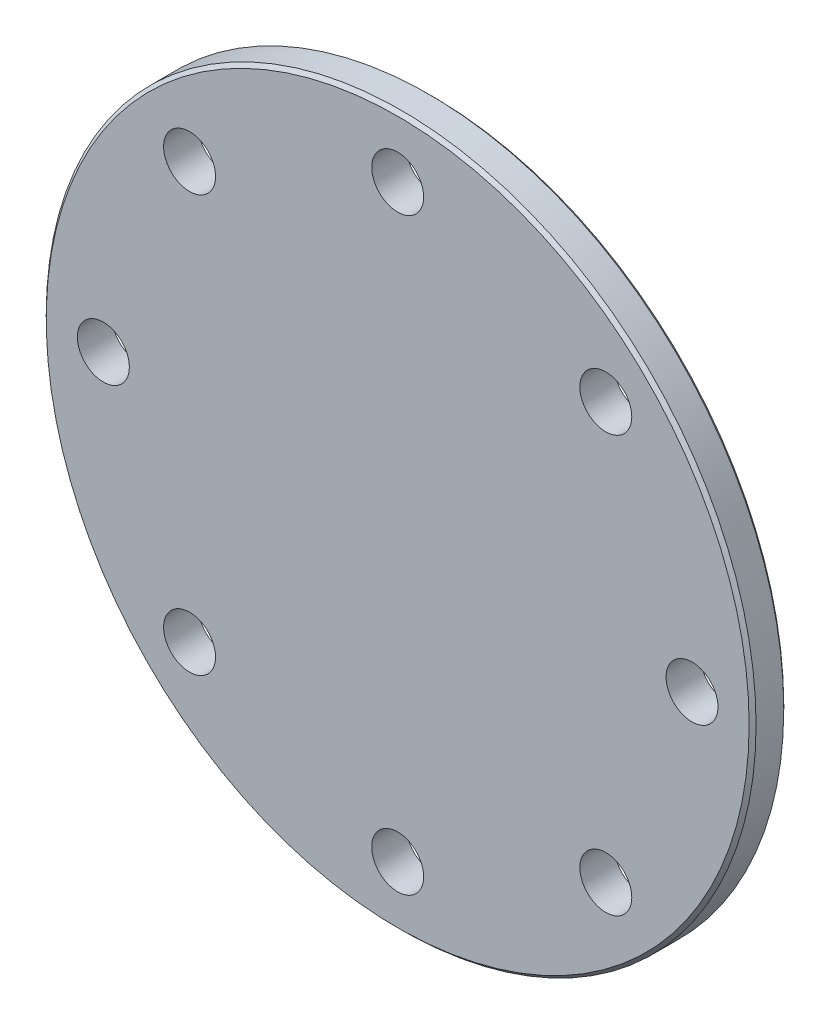
ISO-10303-21;
HEADER;
FILE_DESCRIPTION(('STEP AP214'),'2;1');
FILE_NAME('part.step','',(''),(''),'','','');
FILE_SCHEMA(('AUTOMOTIVE_DESIGN { 1 0 10303 214 1 1 1 1 }'));
ENDSEC;
DATA;
#1=APPLICATION_CONTEXT('core data for automotive mechanical design processes');
#2=APPLICATION_PROTOCOL_DEFINITION('international standard','automotive_design',2000,#1);
#3=PRODUCT_CONTEXT('',#1,'mechanical');
#4=PRODUCT('Part','Part','',(#3));
#5=PRODUCT_RELATED_PRODUCT_CATEGORY('part','',(#4));
#6=PRODUCT_DEFINITION_FORMATION('','',#4);
#7=PRODUCT_DEFINITION_CONTEXT('part definition',#1,'design');
#8=PRODUCT_DEFINITION('design','',#6,#7);
#9=PRODUCT_DEFINITION_SHAPE('','',#8);
#10=(LENGTH_UNIT() NAMED_UNIT(*) SI_UNIT(.MILLI.,.METRE.));
#11=(NAMED_UNIT(*) PLANE_ANGLE_UNIT() SI_UNIT($,.RADIAN.));
#12=(NAMED_UNIT(*) SI_UNIT($,.STERADIAN.) SOLID_ANGLE_UNIT());
#13=UNCERTAINTY_MEASURE_WITH_UNIT(LENGTH_MEASURE(1.E-05),#10,'distance_accuracy_value','');
#14=(GEOMETRIC_REPRESENTATION_CONTEXT(3) GLOBAL_UNCERTAINTY_ASSIGNED_CONTEXT((#13)) GLOBAL_UNIT_ASSIGNED_CONTEXT((#10,
#11,#12)) REPRESENTATION_CONTEXT('',''));
#15=CARTESIAN_POINT('',(0.,0.,0.));
#16=DIRECTION('',(0.,0.,1.));
#17=DIRECTION('',(1.,0.,0.));
#18=AXIS2_PLACEMENT_3D('',#15,#16,#17);
#19=CARTESIAN_POINT('',(0.,0.,20.));
#20=DIRECTION('',(0.,0.,1.));
#21=DIRECTION('',(1.,0.,0.));
#22=AXIS2_PLACEMENT_3D('',#19,#20,#21);
#23=PLANE('',#22);
#24=CARTESIAN_POINT('',(0.,0.,20.));
#25=DIRECTION('',(0.,0.,1.));
#26=DIRECTION('',(1.,0.,0.));
#27=AXIS2_PLACEMENT_3D('',#24,#25,#26);
#28=CIRCLE('',#27,203.);
#29=CARTESIAN_POINT('',(203.,0.,20.));
#30=VERTEX_POINT('',#29);
#31=EDGE_CURVE('E10',#30,#30,#28,.T.);
#32=ORIENTED_EDGE('',*,*,#31,.T.);
#33=EDGE_LOOP('',(#32));
#34=FACE_BOUND('',#33,.T.);
#35=CARTESIAN_POINT('',(-169.999999999992,-7.67202457601036E-12,20.));
#36=DIRECTION('',(0.,0.,1.));
#37=DIRECTION('',(1.,0.,0.));
#38=AXIS2_PLACEMENT_3D('',#35,#36,#37);
#39=CIRCLE('',#38,15.);
#40=CARTESIAN_POINT('',(-154.999999999992,-7.67202457601036E-12,20.));
#41=VERTEX_POINT('',#40);
#42=EDGE_CURVE('E85',#41,#41,#39,.T.);
#43=ORIENTED_EDGE('',*,*,#42,.F.);
#44=EDGE_LOOP('',(#43));
#45=FACE_BOUND('',#44,.T.);
#46=CARTESIAN_POINT('',(1.53024111608497E-11,-170.,20.));
#47=DIRECTION('',(0.,0.,1.));
#48=DIRECTION('',(1.,0.,0.));
#49=AXIS2_PLACEMENT_3D('',#46,#47,#48);
#50=CIRCLE('',#49,15.);
#51=CARTESIAN_POINT('',(15.0000000000153,-170.,20.));
#52=VERTEX_POINT('',#51);
#53=EDGE_CURVE('E73',#52,#52,#50,.T.);
#54=ORIENTED_EDGE('',*,*,#53,.F.);
#55=EDGE_LOOP('',(#54));
#56=FACE_BOUND('',#55,.T.);
#57=CARTESIAN_POINT('',(170.000000000008,7.65120558042486E-12,20.));
#58=DIRECTION('',(0.,0.,1.));
#59=DIRECTION('',(1.,0.,0.));
#60=AXIS2_PLACEMENT_3D('',#57,#58,#59);
#61=CIRCLE('',#60,15.);
#62=CARTESIAN_POINT('',(185.000000000008,7.65120558042486E-12,20.));
#63=VERTEX_POINT('',#62);
#64=EDGE_CURVE('E61',#63,#63,#61,.T.);
#65=ORIENTED_EDGE('',*,*,#64,.F.);
#66=EDGE_LOOP('',(#65));
#67=FACE_BOUND('',#66,.T.);
#68=CARTESIAN_POINT('',(0.,170.,20.));
#69=DIRECTION('',(0.,0.,1.));
#70=DIRECTION('',(1.,0.,0.));
#71=AXIS2_PLACEMENT_3D('',#68,#69,#70);
#72=CIRCLE('',#71,15.);
#73=CARTESIAN_POINT('',(15.,170.,20.));
#74=VERTEX_POINT('',#73);
#75=EDGE_CURVE('E51',#74,#74,#72,.T.);
#76=ORIENTED_EDGE('',*,*,#75,.F.);
#77=EDGE_LOOP('',(#76));
#78=FACE_BOUND('',#77,.T.);
#79=CARTESIAN_POINT('',(120.208152801715,120.208152801718,20.));
#80=DIRECTION('',(0.,0.,1.));
#81=DIRECTION('',(1.,0.,0.));
#82=AXIS2_PLACEMENT_3D('',#79,#80,#81);
#83=CIRCLE('',#82,15.0000000000009);
#84=CARTESIAN_POINT('',(135.208152801716,120.208152801718,20.));
#85=VERTEX_POINT('',#84);
#86=EDGE_CURVE('E55',#85,#85,#83,.T.);
#87=ORIENTED_EDGE('',*,*,#86,.F.);
#88=EDGE_LOOP('',(#87));
#89=FACE_BOUND('',#88,.T.);
#90=CARTESIAN_POINT('',(120.208152801726,-120.208152801708,20.));
#91=DIRECTION('',(0.,0.,1.));
#92=DIRECTION('',(1.,0.,0.));
#93=AXIS2_PLACEMENT_3D('',#90,#91,#92);
#94=CIRCLE('',#93,15.);
#95=CARTESIAN_POINT('',(135.208152801726,-120.208152801708,20.));
#96=VERTEX_POINT('',#95);
#97=EDGE_CURVE('E67',#96,#96,#94,.T.);
#98=ORIENTED_EDGE('',*,*,#97,.F.);
#99=EDGE_LOOP('',(#98));
#100=FACE_BOUND('',#99,.T.);
#101=CARTESIAN_POINT('',(-120.2081528017,-120.208152801719,20.));
#102=DIRECTION('',(0.,0.,1.));
#103=DIRECTION('',(1.,0.,0.));
#104=AXIS2_PLACEMENT_3D('',#101,#102,#103);
#105=CIRCLE('',#104,15.);
#106=CARTESIAN_POINT('',(-105.2081528017,-120.208152801719,20.));
#107=VERTEX_POINT('',#106);
#108=EDGE_CURVE('E79',#107,#107,#105,.T.);
#109=ORIENTED_EDGE('',*,*,#108,.F.);
#110=EDGE_LOOP('',(#109));
#111=FACE_BOUND('',#110,.T.);
#112=CARTESIAN_POINT('',(-120.208152801711,120.208152801708,20.));
#113=DIRECTION('',(0.,0.,1.));
#114=DIRECTION('',(1.,0.,0.));
#115=AXIS2_PLACEMENT_3D('',#112,#113,#114);
#116=CIRCLE('',#115,15.);
#117=CARTESIAN_POINT('',(-105.208152801711,120.208152801708,20.));
#118=VERTEX_POINT('',#117);
#119=EDGE_CURVE('E91',#118,#118,#116,.T.);
#120=ORIENTED_EDGE('',*,*,#119,.F.);
#121=EDGE_LOOP('',(#120));
#122=FACE_BOUND('',#121,.T.);
#123=ADVANCED_FACE('F31',(#34,#45,#56,#67,#78,#89,#100,#111,#122),#23,.T.);
#124=CARTESIAN_POINT('',(0.,0.,0.));
#125=DIRECTION('',(0.,0.,1.));
#126=DIRECTION('',(1.,0.,0.));
#127=AXIS2_PLACEMENT_3D('',#124,#125,#126);
#128=PLANE('',#127);
#129=CARTESIAN_POINT('',(0.,0.,0.));
#130=DIRECTION('',(0.,0.,1.));
#131=DIRECTION('',(1.,0.,0.));
#132=AXIS2_PLACEMENT_3D('',#129,#130,#131);
#133=CIRCLE('',#132,203.);
#134=CARTESIAN_POINT('',(203.,0.,0.));
#135=VERTEX_POINT('',#134);
#136=EDGE_CURVE('E38',#135,#135,#133,.F.);
#137=ORIENTED_EDGE('',*,*,#136,.T.);
#138=EDGE_LOOP('',(#137));
#139=FACE_BOUND('',#138,.T.);
#140=CARTESIAN_POINT('',(0.,170.,0.));
#141=DIRECTION('',(0.,0.,1.));
#142=DIRECTION('',(1.,0.,0.));
#143=AXIS2_PLACEMENT_3D('',#140,#141,#142);
#144=CIRCLE('',#143,15.);
#145=CARTESIAN_POINT('',(15.,170.,0.));
#146=VERTEX_POINT('',#145);
#147=EDGE_CURVE('E52',#146,#146,#144,.T.);
#148=ORIENTED_EDGE('',*,*,#147,.T.);
#149=EDGE_LOOP('',(#148));
#150=FACE_BOUND('',#149,.T.);
#151=CARTESIAN_POINT('',(120.208152801715,120.208152801718,0.));
#152=DIRECTION('',(0.,0.,1.));
#153=DIRECTION('',(1.,0.,0.));
#154=AXIS2_PLACEMENT_3D('',#151,#152,#153);
#155=CIRCLE('',#154,15.0000000000009);
#156=CARTESIAN_POINT('',(135.208152801716,120.208152801718,0.));
#157=VERTEX_POINT('',#156);
#158=EDGE_CURVE('E58',#157,#157,#155,.T.);
#159=ORIENTED_EDGE('',*,*,#158,.T.);
#160=EDGE_LOOP('',(#159));
#161=FACE_BOUND('',#160,.T.);
#162=CARTESIAN_POINT('',(170.000000000008,7.65120558042486E-12,0.));
#163=DIRECTION('',(0.,0.,1.));
#164=DIRECTION('',(1.,0.,0.));
#165=AXIS2_PLACEMENT_3D('',#162,#163,#164);
#166=CIRCLE('',#165,15.);
#167=CARTESIAN_POINT('',(185.000000000008,7.65120558042486E-12,0.));
#168=VERTEX_POINT('',#167);
#169=EDGE_CURVE('E64',#168,#168,#166,.T.);
#170=ORIENTED_EDGE('',*,*,#169,.T.);
#171=EDGE_LOOP('',(#170));
#172=FACE_BOUND('',#171,.T.);
#173=CARTESIAN_POINT('',(120.208152801726,-120.208152801708,0.));
#174=DIRECTION('',(0.,0.,1.));
#175=DIRECTION('',(1.,0.,0.));
#176=AXIS2_PLACEMENT_3D('',#173,#174,#175);
#177=CIRCLE('',#176,15.);
#178=CARTESIAN_POINT('',(135.208152801726,-120.208152801708,0.));
#179=VERTEX_POINT('',#178);
#180=EDGE_CURVE('E70',#179,#179,#177,.T.);
#181=ORIENTED_EDGE('',*,*,#180,.T.);
#182=EDGE_LOOP('',(#181));
#183=FACE_BOUND('',#182,.T.);
#184=CARTESIAN_POINT('',(1.53024111608497E-11,-170.,0.));
#185=DIRECTION('',(0.,0.,1.));
#186=DIRECTION('',(1.,0.,0.));
#187=AXIS2_PLACEMENT_3D('',#184,#185,#186);
#188=CIRCLE('',#187,15.);
#189=CARTESIAN_POINT('',(15.0000000000153,-170.,0.));
#190=VERTEX_POINT('',#189);
#191=EDGE_CURVE('E76',#190,#190,#188,.T.);
#192=ORIENTED_EDGE('',*,*,#191,.T.);
#193=EDGE_LOOP('',(#192));
#194=FACE_BOUND('',#193,.T.);
#195=CARTESIAN_POINT('',(-120.2081528017,-120.208152801719,0.));
#196=DIRECTION('',(0.,0.,1.));
#197=DIRECTION('',(1.,0.,0.));
#198=AXIS2_PLACEMENT_3D('',#195,#196,#197);
#199=CIRCLE('',#198,15.);
#200=CARTESIAN_POINT('',(-105.2081528017,-120.208152801719,0.));
#201=VERTEX_POINT('',#200);
#202=EDGE_CURVE('E82',#201,#201,#199,.T.);
#203=ORIENTED_EDGE('',*,*,#202,.T.);
#204=EDGE_LOOP('',(#203));
#205=FACE_BOUND('',#204,.T.);
#206=CARTESIAN_POINT('',(-169.999999999992,-7.67202457601036E-12,0.));
#207=DIRECTION('',(0.,0.,1.));
#208=DIRECTION('',(1.,0.,0.));
#209=AXIS2_PLACEMENT_3D('',#206,#207,#208);
#210=CIRCLE('',#209,15.);
#211=CARTESIAN_POINT('',(-154.999999999992,-7.67202457601036E-12,0.));
#212=VERTEX_POINT('',#211);
#213=EDGE_CURVE('E88',#212,#212,#210,.T.);
#214=ORIENTED_EDGE('',*,*,#213,.T.);
#215=EDGE_LOOP('',(#214));
#216=FACE_BOUND('',#215,.T.);
#217=CARTESIAN_POINT('',(-120.208152801711,120.208152801708,0.));
#218=DIRECTION('',(0.,0.,1.));
#219=DIRECTION('',(1.,0.,0.));
#220=AXIS2_PLACEMENT_3D('',#217,#218,#219);
#221=CIRCLE('',#220,15.);
#222=CARTESIAN_POINT('',(-105.208152801711,120.208152801708,0.));
#223=VERTEX_POINT('',#222);
#224=EDGE_CURVE('E94',#223,#223,#221,.T.);
#225=ORIENTED_EDGE('',*,*,#224,.T.);
#226=EDGE_LOOP('',(#225));
#227=FACE_BOUND('',#226,.T.);
#228=ADVANCED_FACE('F104',(#139,#150,#161,#172,#183,#194,#205,#216,#227),#128,.F.);
#229=CARTESIAN_POINT('',(0.,0.,20.));
#230=DIRECTION('',(0.,0.,-1.));
#231=DIRECTION('',(-1.,0.,0.));
#232=AXIS2_PLACEMENT_3D('',#229,#230,#231);
#233=CYLINDRICAL_SURFACE('',#232,205.);
#234=CARTESIAN_POINT('',(0.,0.,2.00000000000006));
#235=DIRECTION('',(0.,0.,1.));
#236=DIRECTION('',(1.,0.,0.));
#237=AXIS2_PLACEMENT_3D('',#234,#235,#236);
#238=CIRCLE('',#237,205.);
#239=CARTESIAN_POINT('',(205.,0.,2.00000000000006));
#240=VERTEX_POINT('',#239);
#241=EDGE_CURVE('E42',#240,#240,#238,.T.);
#242=ORIENTED_EDGE('',*,*,#241,.T.);
#243=EDGE_LOOP('',(#242));
#244=FACE_BOUND('',#243,.T.);
#245=CARTESIAN_POINT('',(0.,0.,18.));
#246=DIRECTION('',(0.,0.,1.));
#247=DIRECTION('',(1.,0.,0.));
#248=AXIS2_PLACEMENT_3D('',#245,#246,#247);
#249=CIRCLE('',#248,205.);
#250=CARTESIAN_POINT('',(205.,0.,18.));
#251=VERTEX_POINT('',#250);
#252=EDGE_CURVE('E46',#251,#251,#249,.F.);
#253=ORIENTED_EDGE('',*,*,#252,.T.);
#254=EDGE_LOOP('',(#253));
#255=FACE_BOUND('',#254,.T.);
#256=ADVANCED_FACE('F109',(#244,#255),#233,.T.);
#257=CARTESIAN_POINT('',(0.,170.,20.));
#258=DIRECTION('',(0.,0.,-1.));
#259=DIRECTION('',(-1.,0.,0.));
#260=AXIS2_PLACEMENT_3D('',#257,#258,#259);
#261=CYLINDRICAL_SURFACE('',#260,15.);
#262=ORIENTED_EDGE('',*,*,#75,.T.);
#263=EDGE_LOOP('',(#262));
#264=FACE_BOUND('',#263,.T.);
#265=ORIENTED_EDGE('',*,*,#147,.F.);
#266=EDGE_LOOP('',(#265));
#267=FACE_BOUND('',#266,.T.);
#268=ADVANCED_FACE('F113',(#264,#267),#261,.F.);
#269=CARTESIAN_POINT('',(120.208152801715,120.208152801718,20.));
#270=DIRECTION('',(0.,0.,-1.));
#271=DIRECTION('',(-1.,0.,0.));
#272=AXIS2_PLACEMENT_3D('',#269,#270,#271);
#273=CYLINDRICAL_SURFACE('',#272,15.0000000000009);
#274=ORIENTED_EDGE('',*,*,#86,.T.);
#275=EDGE_LOOP('',(#274));
#276=FACE_BOUND('',#275,.T.);
#277=ORIENTED_EDGE('',*,*,#158,.F.);
#278=EDGE_LOOP('',(#277));
#279=FACE_BOUND('',#278,.T.);
#280=ADVANCED_FACE('F153',(#276,#279),#273,.F.);
#281=CARTESIAN_POINT('',(170.000000000008,7.65120558042486E-12,20.));
#282=DIRECTION('',(0.,0.,-1.));
#283=DIRECTION('',(-1.,0.,0.));
#284=AXIS2_PLACEMENT_3D('',#281,#282,#283);
#285=CYLINDRICAL_SURFACE('',#284,15.);
#286=ORIENTED_EDGE('',*,*,#64,.T.);
#287=EDGE_LOOP('',(#286));
#288=FACE_BOUND('',#287,.T.);
#289=ORIENTED_EDGE('',*,*,#169,.F.);
#290=EDGE_LOOP('',(#289));
#291=FACE_BOUND('',#290,.T.);
#292=ADVANCED_FACE('F150',(#288,#291),#285,.F.);
#293=CARTESIAN_POINT('',(120.208152801726,-120.208152801708,20.));
#294=DIRECTION('',(0.,0.,-1.));
#295=DIRECTION('',(-1.,0.,0.));
#296=AXIS2_PLACEMENT_3D('',#293,#294,#295);
#297=CYLINDRICAL_SURFACE('',#296,15.);
#298=ORIENTED_EDGE('',*,*,#97,.T.);
#299=EDGE_LOOP('',(#298));
#300=FACE_BOUND('',#299,.T.);
#301=ORIENTED_EDGE('',*,*,#180,.F.);
#302=EDGE_LOOP('',(#301));
#303=FACE_BOUND('',#302,.T.);
#304=ADVANCED_FACE('F146',(#300,#303),#297,.F.);
#305=CARTESIAN_POINT('',(1.53024111608497E-11,-170.,20.));
#306=DIRECTION('',(0.,0.,-1.));
#307=DIRECTION('',(-1.,0.,0.));
#308=AXIS2_PLACEMENT_3D('',#305,#306,#307);
#309=CYLINDRICAL_SURFACE('',#308,15.);
#310=ORIENTED_EDGE('',*,*,#53,.T.);
#311=EDGE_LOOP('',(#310));
#312=FACE_BOUND('',#311,.T.);
#313=ORIENTED_EDGE('',*,*,#191,.F.);
#314=EDGE_LOOP('',(#313));
#315=FACE_BOUND('',#314,.T.);
#316=ADVANCED_FACE('F142',(#312,#315),#309,.F.);
#317=CARTESIAN_POINT('',(-120.2081528017,-120.208152801719,20.));
#318=DIRECTION('',(0.,0.,-1.));
#319=DIRECTION('',(-1.,0.,0.));
#320=AXIS2_PLACEMENT_3D('',#317,#318,#319);
#321=CYLINDRICAL_SURFACE('',#320,15.);
#322=ORIENTED_EDGE('',*,*,#108,.T.);
#323=EDGE_LOOP('',(#322));
#324=FACE_BOUND('',#323,.T.);
#325=ORIENTED_EDGE('',*,*,#202,.F.);
#326=EDGE_LOOP('',(#325));
#327=FACE_BOUND('',#326,.T.);
#328=ADVANCED_FACE('F136',(#324,#327),#321,.F.);
#329=CARTESIAN_POINT('',(-169.999999999992,-7.67202457601036E-12,20.));
#330=DIRECTION('',(0.,0.,-1.));
#331=DIRECTION('',(-1.,0.,0.));
#332=AXIS2_PLACEMENT_3D('',#329,#330,#331);
#333=CYLINDRICAL_SURFACE('',#332,15.);
#334=ORIENTED_EDGE('',*,*,#42,.T.);
#335=EDGE_LOOP('',(#334));
#336=FACE_BOUND('',#335,.T.);
#337=ORIENTED_EDGE('',*,*,#213,.F.);
#338=EDGE_LOOP('',(#337));
#339=FACE_BOUND('',#338,.T.);
#340=ADVANCED_FACE('F126',(#336,#339),#333,.F.);
#341=CARTESIAN_POINT('',(-120.208152801711,120.208152801708,20.));
#342=DIRECTION('',(0.,0.,-1.));
#343=DIRECTION('',(-1.,0.,0.));
#344=AXIS2_PLACEMENT_3D('',#341,#342,#343);
#345=CYLINDRICAL_SURFACE('',#344,15.);
#346=ORIENTED_EDGE('',*,*,#119,.T.);
#347=EDGE_LOOP('',(#346));
#348=FACE_BOUND('',#347,.T.);
#349=ORIENTED_EDGE('',*,*,#224,.F.);
#350=EDGE_LOOP('',(#349));
#351=FACE_BOUND('',#350,.T.);
#352=ADVANCED_FACE('F100',(#348,#351),#345,.F.);
#353=CARTESIAN_POINT('',(0.,0.,2.00000000000006));
#354=DIRECTION('',(0.,0.,1.));
#355=DIRECTION('',(1.,0.,0.));
#356=AXIS2_PLACEMENT_3D('',#353,#354,#355);
#357=CONICAL_SURFACE('',#356,205.,0.785398163397441);
#358=ORIENTED_EDGE('',*,*,#136,.F.);
#359=EDGE_LOOP('',(#358));
#360=FACE_BOUND('',#359,.T.);
#361=ORIENTED_EDGE('',*,*,#241,.F.);
#362=EDGE_LOOP('',(#361));
#363=FACE_BOUND('',#362,.T.);
#364=ADVANCED_FACE('F118',(#360,#363),#357,.T.);
#365=CARTESIAN_POINT('',(0.,0.,20.));
#366=DIRECTION('',(0.,0.,-1.));
#367=DIRECTION('',(-1.,0.,0.));
#368=AXIS2_PLACEMENT_3D('',#365,#366,#367);
#369=CONICAL_SURFACE('',#368,203.,0.785398163397469);
#370=ORIENTED_EDGE('',*,*,#252,.F.);
#371=EDGE_LOOP('',(#370));
#372=FACE_BOUND('',#371,.T.);
#373=ORIENTED_EDGE('',*,*,#31,.F.);
#374=EDGE_LOOP('',(#373));
#375=FACE_BOUND('',#374,.T.);
#376=ADVANCED_FACE('F33',(#372,#375),#369,.T.);
#377=CLOSED_SHELL('',(#123,#228,#256,#268,#280,#292,#304,#316,#328,#340,#352,#364,#376));
#378=MANIFOLD_SOLID_BREP('B2',#377);
#379=ADVANCED_BREP_SHAPE_REPRESENTATION('',(#18,#378),#14);
#380=SHAPE_DEFINITION_REPRESENTATION(#9,#379);
ENDSEC;
END-ISO-10303-21;
